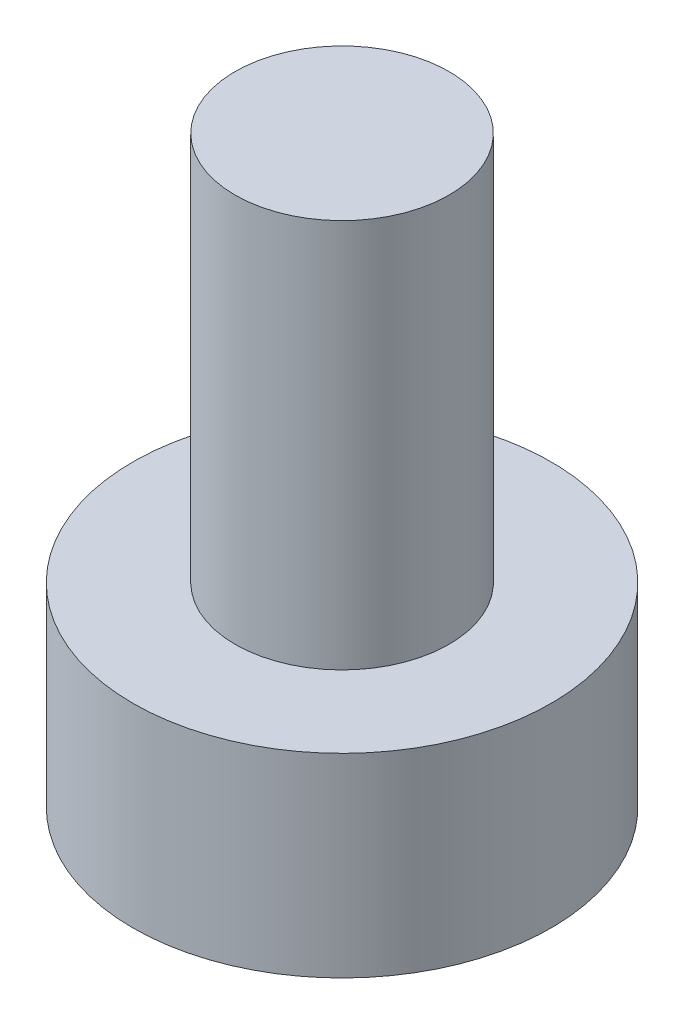
ISO-10303-21;
HEADER;
FILE_DESCRIPTION(('STEP AP214'),'2;1');
FILE_NAME('part.step','',(''),(''),'','','');
FILE_SCHEMA(('AUTOMOTIVE_DESIGN { 1 0 10303 214 1 1 1 1 }'));
ENDSEC;
DATA;
#1=APPLICATION_CONTEXT('core data for automotive mechanical design processes');
#2=APPLICATION_PROTOCOL_DEFINITION('international standard','automotive_design',2000,#1);
#3=PRODUCT_CONTEXT('',#1,'mechanical');
#4=PRODUCT('Part','Part','',(#3));
#5=PRODUCT_RELATED_PRODUCT_CATEGORY('part','',(#4));
#6=PRODUCT_DEFINITION_FORMATION('','',#4);
#7=PRODUCT_DEFINITION_CONTEXT('part definition',#1,'design');
#8=PRODUCT_DEFINITION('design','',#6,#7);
#9=PRODUCT_DEFINITION_SHAPE('','',#8);
#10=(LENGTH_UNIT() NAMED_UNIT(*) SI_UNIT(.MILLI.,.METRE.));
#11=(NAMED_UNIT(*) PLANE_ANGLE_UNIT() SI_UNIT($,.RADIAN.));
#12=(NAMED_UNIT(*) SI_UNIT($,.STERADIAN.) SOLID_ANGLE_UNIT());
#13=UNCERTAINTY_MEASURE_WITH_UNIT(LENGTH_MEASURE(1.E-05),#10,'distance_accuracy_value','');
#14=(GEOMETRIC_REPRESENTATION_CONTEXT(3) GLOBAL_UNCERTAINTY_ASSIGNED_CONTEXT((#13)) GLOBAL_UNIT_ASSIGNED_CONTEXT((#10,
#11,#12)) REPRESENTATION_CONTEXT('',''));
#15=CARTESIAN_POINT('',(0.,0.,0.));
#16=DIRECTION('',(0.,0.,1.));
#17=DIRECTION('',(1.,0.,0.));
#18=AXIS2_PLACEMENT_3D('',#15,#16,#17);
#19=CARTESIAN_POINT('',(0.,2.,0.));
#20=DIRECTION('',(0.,-1.,0.));
#21=DIRECTION('',(0.,0.,-1.));
#22=AXIS2_PLACEMENT_3D('',#19,#20,#21);
#23=CYLINDRICAL_SURFACE('',#22,2.15);
#24=CARTESIAN_POINT('',(0.,2.,0.));
#25=DIRECTION('',(0.,1.,0.));
#26=DIRECTION('',(0.,0.,1.));
#27=AXIS2_PLACEMENT_3D('',#24,#25,#26);
#28=CIRCLE('',#27,2.15);
#29=CARTESIAN_POINT('',(0.,2.,2.15));
#30=VERTEX_POINT('',#29);
#31=EDGE_CURVE('E38',#30,#30,#28,.T.);
#32=ORIENTED_EDGE('',*,*,#31,.F.);
#33=EDGE_LOOP('',(#32));
#34=FACE_BOUND('',#33,.T.);
#35=CARTESIAN_POINT('',(0.,0.,0.));
#36=DIRECTION('',(0.,1.,0.));
#37=DIRECTION('',(0.,0.,1.));
#38=AXIS2_PLACEMENT_3D('',#35,#36,#37);
#39=CIRCLE('',#38,2.15);
#40=CARTESIAN_POINT('',(0.,0.,2.15));
#41=VERTEX_POINT('',#40);
#42=EDGE_CURVE('E34',#41,#41,#39,.T.);
#43=ORIENTED_EDGE('',*,*,#42,.T.);
#44=EDGE_LOOP('',(#43));
#45=FACE_BOUND('',#44,.T.);
#46=ADVANCED_FACE('F31',(#34,#45),#23,.T.);
#47=CARTESIAN_POINT('',(0.,2.,0.));
#48=DIRECTION('',(0.,1.,0.));
#49=DIRECTION('',(0.,0.,1.));
#50=AXIS2_PLACEMENT_3D('',#47,#48,#49);
#51=PLANE('',#50);
#52=CARTESIAN_POINT('',(0.,2.,0.));
#53=DIRECTION('',(0.,1.,0.));
#54=DIRECTION('',(0.,0.,1.));
#55=AXIS2_PLACEMENT_3D('',#52,#53,#54);
#56=CIRCLE('',#55,1.1);
#57=CARTESIAN_POINT('',(0.,2.,1.1));
#58=VERTEX_POINT('',#57);
#59=EDGE_CURVE('E10',#58,#58,#56,.T.);
#60=ORIENTED_EDGE('',*,*,#59,.F.);
#61=EDGE_LOOP('',(#60));
#62=FACE_BOUND('',#61,.T.);
#63=ORIENTED_EDGE('',*,*,#31,.T.);
#64=EDGE_LOOP('',(#63));
#65=FACE_BOUND('',#64,.T.);
#66=ADVANCED_FACE('F55',(#62,#65),#51,.T.);
#67=CARTESIAN_POINT('',(0.,0.,0.));
#68=DIRECTION('',(0.,1.,0.));
#69=DIRECTION('',(0.,0.,1.));
#70=AXIS2_PLACEMENT_3D('',#67,#68,#69);
#71=PLANE('',#70);
#72=ORIENTED_EDGE('',*,*,#42,.F.);
#73=EDGE_LOOP('',(#72));
#74=FACE_BOUND('',#73,.T.);
#75=ADVANCED_FACE('F52',(#74),#71,.F.);
#76=CARTESIAN_POINT('',(0.,6.,0.));
#77=DIRECTION('',(0.,-1.,0.));
#78=DIRECTION('',(0.,0.,-1.));
#79=AXIS2_PLACEMENT_3D('',#76,#77,#78);
#80=CYLINDRICAL_SURFACE('',#79,1.1);
#81=CARTESIAN_POINT('',(0.,6.,0.));
#82=DIRECTION('',(0.,1.,0.));
#83=DIRECTION('',(0.,0.,1.));
#84=AXIS2_PLACEMENT_3D('',#81,#82,#83);
#85=CIRCLE('',#84,1.1);
#86=CARTESIAN_POINT('',(0.,6.,1.1));
#87=VERTEX_POINT('',#86);
#88=EDGE_CURVE('E44',#87,#87,#85,.T.);
#89=ORIENTED_EDGE('',*,*,#88,.F.);
#90=EDGE_LOOP('',(#89));
#91=FACE_BOUND('',#90,.T.);
#92=ORIENTED_EDGE('',*,*,#59,.T.);
#93=EDGE_LOOP('',(#92));
#94=FACE_BOUND('',#93,.T.);
#95=ADVANCED_FACE('F54',(#91,#94),#80,.T.);
#96=CARTESIAN_POINT('',(0.,6.,0.));
#97=DIRECTION('',(0.,1.,0.));
#98=DIRECTION('',(0.,0.,1.));
#99=AXIS2_PLACEMENT_3D('',#96,#97,#98);
#100=PLANE('',#99);
#101=ORIENTED_EDGE('',*,*,#88,.T.);
#102=EDGE_LOOP('',(#101));
#103=FACE_BOUND('',#102,.T.);
#104=ADVANCED_FACE('F60',(#103),#100,.T.);
#105=CLOSED_SHELL('',(#46,#66,#75,#95,#104));
#106=MANIFOLD_SOLID_BREP('B2',#105);
#107=ADVANCED_BREP_SHAPE_REPRESENTATION('',(#18,#106),#14);
#108=SHAPE_DEFINITION_REPRESENTATION(#9,#107);
ENDSEC;
END-ISO-10303-21;
